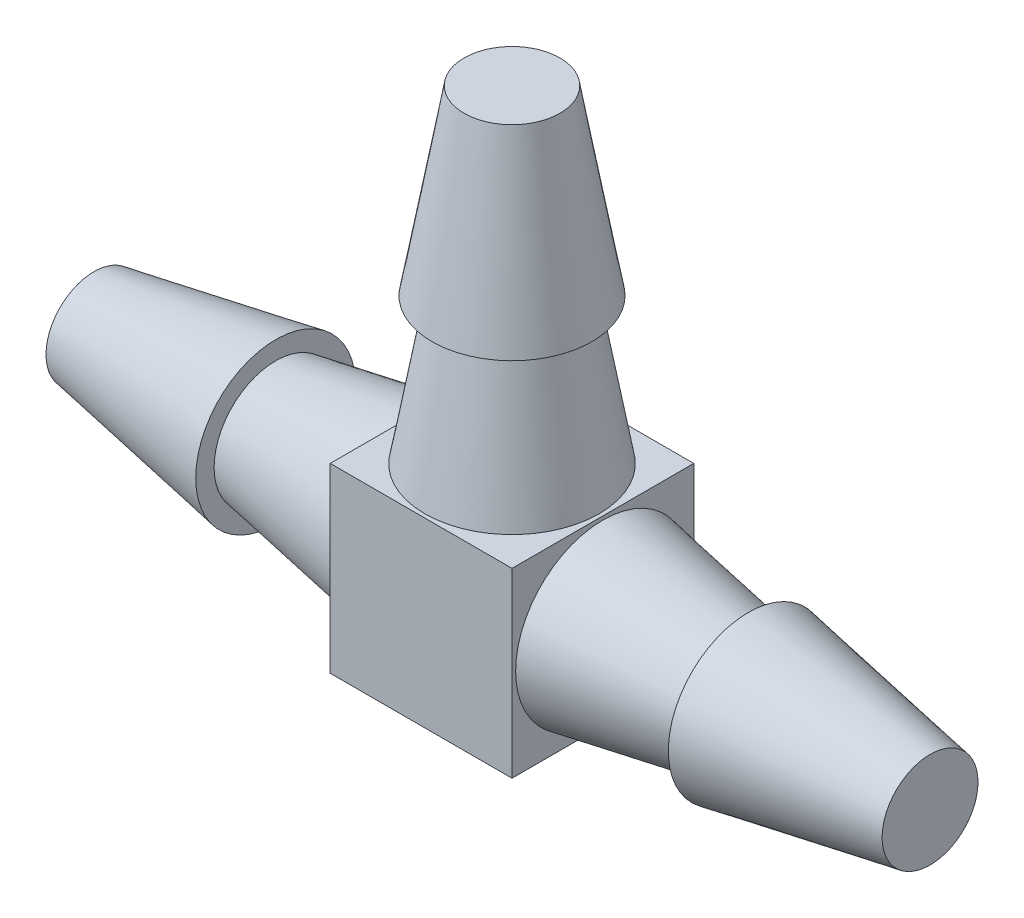
ISO-10303-21;
HEADER;
FILE_DESCRIPTION(('STEP AP214'),'2;1');
FILE_NAME('part.step','',(''),(''),'','','');
FILE_SCHEMA(('AUTOMOTIVE_DESIGN { 1 0 10303 214 1 1 1 1 }'));
ENDSEC;
DATA;
#1=APPLICATION_CONTEXT('core data for automotive mechanical design processes');
#2=APPLICATION_PROTOCOL_DEFINITION('international standard','automotive_design',2000,#1);
#3=PRODUCT_CONTEXT('',#1,'mechanical');
#4=PRODUCT('Part','Part','',(#3));
#5=PRODUCT_RELATED_PRODUCT_CATEGORY('part','',(#4));
#6=PRODUCT_DEFINITION_FORMATION('','',#4);
#7=PRODUCT_DEFINITION_CONTEXT('part definition',#1,'design');
#8=PRODUCT_DEFINITION('design','',#6,#7);
#9=PRODUCT_DEFINITION_SHAPE('','',#8);
#10=(LENGTH_UNIT() NAMED_UNIT(*) SI_UNIT(.MILLI.,.METRE.));
#11=(NAMED_UNIT(*) PLANE_ANGLE_UNIT() SI_UNIT($,.RADIAN.));
#12=(NAMED_UNIT(*) SI_UNIT($,.STERADIAN.) SOLID_ANGLE_UNIT());
#13=UNCERTAINTY_MEASURE_WITH_UNIT(LENGTH_MEASURE(1.E-05),#10,'distance_accuracy_value','');
#14=(GEOMETRIC_REPRESENTATION_CONTEXT(3) GLOBAL_UNCERTAINTY_ASSIGNED_CONTEXT((#13)) GLOBAL_UNIT_ASSIGNED_CONTEXT((#10,
#11,#12)) REPRESENTATION_CONTEXT('',''));
#15=CARTESIAN_POINT('',(0.,0.,0.));
#16=DIRECTION('',(0.,0.,1.));
#17=DIRECTION('',(1.,0.,0.));
#18=AXIS2_PLACEMENT_3D('',#15,#16,#17);
#19=CARTESIAN_POINT('',(-19.3294385432473,-8.2685128983308,5.));
#20=DIRECTION('',(1.,0.,0.));
#21=DIRECTION('',(0.,0.,-1.));
#22=AXIS2_PLACEMENT_3D('',#19,#20,#21);
#23=PLANE('',#22);
#24=DIRECTION('',(0.,-1.,0.));
#25=VECTOR('',#24,1.);
#26=CARTESIAN_POINT('',(-19.3294385432473,-8.2685128983308,0.));
#27=LINE('',#26,#25);
#28=CARTESIAN_POINT('',(-19.3294385432473,-8.2685128983308,0.));
#29=VERTEX_POINT('',#28);
#30=CARTESIAN_POINT('',(-19.3294385432473,-13.2685128983308,0.));
#31=VERTEX_POINT('',#30);
#32=EDGE_CURVE('E75',#29,#31,#27,.T.);
#33=ORIENTED_EDGE('',*,*,#32,.T.);
#34=DIRECTION('',(0.,0.,-1.));
#35=VECTOR('',#34,1.);
#36=CARTESIAN_POINT('',(-19.3294385432473,-13.2685128983308,5.));
#37=LINE('',#36,#35);
#38=CARTESIAN_POINT('',(-19.3294385432473,-13.2685128983308,5.));
#39=VERTEX_POINT('',#38);
#40=EDGE_CURVE('E93',#39,#31,#37,.T.);
#41=ORIENTED_EDGE('',*,*,#40,.F.);
#42=DIRECTION('',(0.,-1.,0.));
#43=VECTOR('',#42,1.);
#44=CARTESIAN_POINT('',(-19.3294385432473,-8.2685128983308,5.));
#45=LINE('',#44,#43);
#46=CARTESIAN_POINT('',(-19.3294385432473,-8.2685128983308,5.));
#47=VERTEX_POINT('',#46);
#48=EDGE_CURVE('E89',#47,#39,#45,.T.);
#49=ORIENTED_EDGE('',*,*,#48,.F.);
#50=DIRECTION('',(0.,0.,-1.));
#51=VECTOR('',#50,1.);
#52=CARTESIAN_POINT('',(-19.3294385432473,-8.2685128983308,5.));
#53=LINE('',#52,#51);
#54=EDGE_CURVE('E87',#47,#29,#53,.T.);
#55=ORIENTED_EDGE('',*,*,#54,.T.);
#56=EDGE_LOOP('',(#33,#41,#49,#55));
#57=FACE_BOUND('',#56,.T.);
#58=CARTESIAN_POINT('',(-19.3294385432473,-10.7685128983308,2.5));
#59=DIRECTION('',(1.,0.,0.));
#60=DIRECTION('',(0.,0.,-1.));
#61=AXIS2_PLACEMENT_3D('',#58,#59,#60);
#62=CIRCLE('',#61,2.4);
#63=CARTESIAN_POINT('',(-19.3294385432473,-10.7685128983308,0.100000000000001));
#64=VERTEX_POINT('',#63);
#65=EDGE_CURVE('E11',#64,#64,#62,.F.);
#66=ORIENTED_EDGE('',*,*,#65,.F.);
#67=EDGE_LOOP('',(#66));
#68=FACE_BOUND('',#67,.T.);
#69=ADVANCED_FACE('F34',(#57,#68),#23,.F.);
#70=CARTESIAN_POINT('',(-19.3294385432473,-8.2685128983308,5.));
#71=DIRECTION('',(0.,-1.,0.));
#72=DIRECTION('',(1.,0.,0.));
#73=AXIS2_PLACEMENT_3D('',#70,#71,#72);
#74=PLANE('',#73);
#75=DIRECTION('',(-1.,0.,0.));
#76=VECTOR('',#75,1.);
#77=CARTESIAN_POINT('',(-19.3294385432473,-8.2685128983308,0.));
#78=LINE('',#77,#76);
#79=CARTESIAN_POINT('',(-14.3294385432473,-8.2685128983308,0.));
#80=VERTEX_POINT('',#79);
#81=EDGE_CURVE('E80',#80,#29,#78,.T.);
#82=ORIENTED_EDGE('',*,*,#81,.T.);
#83=ORIENTED_EDGE('',*,*,#54,.F.);
#84=DIRECTION('',(-1.,0.,0.));
#85=VECTOR('',#84,1.);
#86=CARTESIAN_POINT('',(-19.3294385432473,-8.2685128983308,5.));
#87=LINE('',#86,#85);
#88=CARTESIAN_POINT('',(-14.3294385432473,-8.2685128983308,5.));
#89=VERTEX_POINT('',#88);
#90=EDGE_CURVE('E108',#89,#47,#87,.T.);
#91=ORIENTED_EDGE('',*,*,#90,.F.);
#92=DIRECTION('',(0.,0.,-1.));
#93=VECTOR('',#92,1.);
#94=CARTESIAN_POINT('',(-14.3294385432473,-8.2685128983308,5.));
#95=LINE('',#94,#93);
#96=EDGE_CURVE('E97',#89,#80,#95,.T.);
#97=ORIENTED_EDGE('',*,*,#96,.T.);
#98=EDGE_LOOP('',(#82,#83,#91,#97));
#99=FACE_BOUND('',#98,.T.);
#100=CARTESIAN_POINT('',(-16.8294385432473,-8.2685128983308,2.5));
#101=DIRECTION('',(0.,-1.,0.));
#102=DIRECTION('',(1.,0.,0.));
#103=AXIS2_PLACEMENT_3D('',#100,#101,#102);
#104=CIRCLE('',#103,2.4);
#105=CARTESIAN_POINT('',(-14.4294385432473,-8.2685128983308,2.5));
#106=VERTEX_POINT('',#105);
#107=EDGE_CURVE('E42',#106,#106,#104,.F.);
#108=ORIENTED_EDGE('',*,*,#107,.F.);
#109=EDGE_LOOP('',(#108));
#110=FACE_BOUND('',#109,.T.);
#111=ADVANCED_FACE('F36',(#99,#110),#74,.F.);
#112=CARTESIAN_POINT('',(-14.3294385432473,-8.2685128983308,5.));
#113=DIRECTION('',(-1.,0.,0.));
#114=DIRECTION('',(0.,0.,1.));
#115=AXIS2_PLACEMENT_3D('',#112,#113,#114);
#116=PLANE('',#115);
#117=DIRECTION('',(0.,1.,0.));
#118=VECTOR('',#117,1.);
#119=CARTESIAN_POINT('',(-14.3294385432473,-8.2685128983308,0.));
#120=LINE('',#119,#118);
#121=CARTESIAN_POINT('',(-14.3294385432473,-13.2685128983308,0.));
#122=VERTEX_POINT('',#121);
#123=EDGE_CURVE('E106',#122,#80,#120,.T.);
#124=ORIENTED_EDGE('',*,*,#123,.T.);
#125=ORIENTED_EDGE('',*,*,#96,.F.);
#126=DIRECTION('',(0.,1.,0.));
#127=VECTOR('',#126,1.);
#128=CARTESIAN_POINT('',(-14.3294385432473,-8.2685128983308,5.));
#129=LINE('',#128,#127);
#130=CARTESIAN_POINT('',(-14.3294385432473,-13.2685128983308,5.));
#131=VERTEX_POINT('',#130);
#132=EDGE_CURVE('E49',#131,#89,#129,.T.);
#133=ORIENTED_EDGE('',*,*,#132,.F.);
#134=DIRECTION('',(0.,0.,-1.));
#135=VECTOR('',#134,1.);
#136=CARTESIAN_POINT('',(-14.3294385432473,-13.2685128983308,5.));
#137=LINE('',#136,#135);
#138=EDGE_CURVE('E114',#131,#122,#137,.T.);
#139=ORIENTED_EDGE('',*,*,#138,.T.);
#140=EDGE_LOOP('',(#124,#125,#133,#139));
#141=FACE_BOUND('',#140,.T.);
#142=CARTESIAN_POINT('',(-14.3294385432473,-10.7685128983308,2.5));
#143=DIRECTION('',(-1.,0.,0.));
#144=DIRECTION('',(0.,0.,1.));
#145=AXIS2_PLACEMENT_3D('',#142,#143,#144);
#146=CIRCLE('',#145,2.4);
#147=CARTESIAN_POINT('',(-14.3294385432473,-10.7685128983308,4.9));
#148=VERTEX_POINT('',#147);
#149=EDGE_CURVE('E92',#148,#148,#146,.F.);
#150=ORIENTED_EDGE('',*,*,#149,.F.);
#151=EDGE_LOOP('',(#150));
#152=FACE_BOUND('',#151,.T.);
#153=ADVANCED_FACE('F124',(#141,#152),#116,.F.);
#154=CARTESIAN_POINT('',(-19.3294385432473,-13.2685128983308,5.));
#155=DIRECTION('',(0.,1.,0.));
#156=DIRECTION('',(-1.,0.,0.));
#157=AXIS2_PLACEMENT_3D('',#154,#155,#156);
#158=PLANE('',#157);
#159=DIRECTION('',(1.,0.,0.));
#160=VECTOR('',#159,1.);
#161=CARTESIAN_POINT('',(-19.3294385432473,-13.2685128983308,0.));
#162=LINE('',#161,#160);
#163=EDGE_CURVE('E81',#31,#122,#162,.T.);
#164=ORIENTED_EDGE('',*,*,#163,.T.);
#165=ORIENTED_EDGE('',*,*,#138,.F.);
#166=DIRECTION('',(1.,0.,0.));
#167=VECTOR('',#166,1.);
#168=CARTESIAN_POINT('',(-19.3294385432473,-13.2685128983308,5.));
#169=LINE('',#168,#167);
#170=EDGE_CURVE('E54',#39,#131,#169,.T.);
#171=ORIENTED_EDGE('',*,*,#170,.F.);
#172=ORIENTED_EDGE('',*,*,#40,.T.);
#173=EDGE_LOOP('',(#164,#165,#171,#172));
#174=FACE_BOUND('',#173,.T.);
#175=ADVANCED_FACE('F129',(#174),#158,.F.);
#176=CARTESIAN_POINT('',(-14.3294385432473,-8.2685128983308,5.));
#177=DIRECTION('',(0.,0.,-1.));
#178=DIRECTION('',(-1.,0.,0.));
#179=AXIS2_PLACEMENT_3D('',#176,#177,#178);
#180=PLANE('',#179);
#181=ORIENTED_EDGE('',*,*,#90,.T.);
#182=ORIENTED_EDGE('',*,*,#48,.T.);
#183=ORIENTED_EDGE('',*,*,#170,.T.);
#184=ORIENTED_EDGE('',*,*,#132,.T.);
#185=EDGE_LOOP('',(#181,#182,#183,#184));
#186=FACE_BOUND('',#185,.T.);
#187=ADVANCED_FACE('F136',(#186),#180,.F.);
#188=CARTESIAN_POINT('',(-14.3294385432473,-8.2685128983308,0.));
#189=DIRECTION('',(0.,0.,-1.));
#190=DIRECTION('',(-1.,0.,0.));
#191=AXIS2_PLACEMENT_3D('',#188,#189,#190);
#192=PLANE('',#191);
#193=ORIENTED_EDGE('',*,*,#81,.F.);
#194=ORIENTED_EDGE('',*,*,#123,.F.);
#195=ORIENTED_EDGE('',*,*,#163,.F.);
#196=ORIENTED_EDGE('',*,*,#32,.F.);
#197=EDGE_LOOP('',(#193,#194,#195,#196));
#198=FACE_BOUND('',#197,.T.);
#199=ADVANCED_FACE('F77',(#198),#192,.T.);
#200=CARTESIAN_POINT('',(-14.3294385432473,-10.7685128983308,2.5));
#201=DIRECTION('',(-1.,0.,0.));
#202=DIRECTION('',(0.,0.,-1.));
#203=AXIS2_PLACEMENT_3D('',#200,#201,#202);
#204=CONICAL_SURFACE('',#203,2.4,0.174532925199433);
#205=CARTESIAN_POINT('',(-10.3294385432473,-10.7685128983308,2.5));
#206=DIRECTION('',(1.,0.,0.));
#207=DIRECTION('',(0.,0.,-1.));
#208=AXIS2_PLACEMENT_3D('',#205,#206,#207);
#209=CIRCLE('',#208,1.69469207716614);
#210=CARTESIAN_POINT('',(-10.3294385432473,-10.7685128983308,0.805307922833862));
#211=VERTEX_POINT('',#210);
#212=EDGE_CURVE('E98',#211,#211,#209,.T.);
#213=ORIENTED_EDGE('',*,*,#212,.F.);
#214=EDGE_LOOP('',(#213));
#215=FACE_BOUND('',#214,.T.);
#216=ORIENTED_EDGE('',*,*,#149,.T.);
#217=EDGE_LOOP('',(#216));
#218=FACE_BOUND('',#217,.T.);
#219=ADVANCED_FACE('F143',(#215,#218),#204,.T.);
#220=CARTESIAN_POINT('',(-16.8294385432473,-8.2685128983308,2.5));
#221=DIRECTION('',(0.,-1.,0.));
#222=DIRECTION('',(-1.,0.,0.));
#223=AXIS2_PLACEMENT_3D('',#220,#221,#222);
#224=CONICAL_SURFACE('',#223,2.4,0.174532925199433);
#225=CARTESIAN_POINT('',(-16.8294385432473,-4.2685128983308,2.5));
#226=DIRECTION('',(0.,1.,0.));
#227=DIRECTION('',(-1.,0.,0.));
#228=AXIS2_PLACEMENT_3D('',#225,#226,#227);
#229=CIRCLE('',#228,1.69469207716614);
#230=CARTESIAN_POINT('',(-18.5241306204135,-4.2685128983308,2.5));
#231=VERTEX_POINT('',#230);
#232=EDGE_CURVE('E101',#231,#231,#229,.T.);
#233=ORIENTED_EDGE('',*,*,#232,.F.);
#234=EDGE_LOOP('',(#233));
#235=FACE_BOUND('',#234,.T.);
#236=ORIENTED_EDGE('',*,*,#107,.T.);
#237=EDGE_LOOP('',(#236));
#238=FACE_BOUND('',#237,.T.);
#239=ADVANCED_FACE('F122',(#235,#238),#224,.T.);
#240=CARTESIAN_POINT('',(-19.3294385432473,-10.7685128983308,2.5));
#241=DIRECTION('',(1.,0.,0.));
#242=DIRECTION('',(0.,0.,1.));
#243=AXIS2_PLACEMENT_3D('',#240,#241,#242);
#244=CONICAL_SURFACE('',#243,2.4,0.174532925199433);
#245=CARTESIAN_POINT('',(-23.3294385432473,-10.7685128983308,2.5));
#246=DIRECTION('',(-1.,0.,0.));
#247=DIRECTION('',(0.,0.,1.));
#248=AXIS2_PLACEMENT_3D('',#245,#246,#247);
#249=CIRCLE('',#248,1.69469207716614);
#250=CARTESIAN_POINT('',(-23.3294385432473,-10.7685128983308,4.19469207716614));
#251=VERTEX_POINT('',#250);
#252=EDGE_CURVE('E217',#251,#251,#249,.T.);
#253=ORIENTED_EDGE('',*,*,#252,.F.);
#254=EDGE_LOOP('',(#253));
#255=FACE_BOUND('',#254,.T.);
#256=ORIENTED_EDGE('',*,*,#65,.T.);
#257=EDGE_LOOP('',(#256));
#258=FACE_BOUND('',#257,.T.);
#259=ADVANCED_FACE('F149',(#255,#258),#244,.T.);
#260=CARTESIAN_POINT('',(-23.3294385432473,-10.7685128983308,2.5));
#261=DIRECTION('',(-1.,0.,0.));
#262=DIRECTION('',(0.,0.,1.));
#263=AXIS2_PLACEMENT_3D('',#260,#261,#262);
#264=PLANE('',#263);
#265=CARTESIAN_POINT('',(-23.3294385432473,-10.7685128983308,2.5));
#266=DIRECTION('',(-1.,0.,0.));
#267=DIRECTION('',(0.,0.,1.));
#268=AXIS2_PLACEMENT_3D('',#265,#266,#267);
#269=CIRCLE('',#268,2.2);
#270=CARTESIAN_POINT('',(-23.3294385432473,-10.7685128983308,4.7));
#271=VERTEX_POINT('',#270);
#272=EDGE_CURVE('E211',#271,#271,#269,.T.);
#273=ORIENTED_EDGE('',*,*,#272,.F.);
#274=EDGE_LOOP('',(#273));
#275=FACE_BOUND('',#274,.T.);
#276=ORIENTED_EDGE('',*,*,#252,.T.);
#277=EDGE_LOOP('',(#276));
#278=FACE_BOUND('',#277,.T.);
#279=ADVANCED_FACE('F153',(#275,#278),#264,.F.);
#280=CARTESIAN_POINT('',(-23.3294385432473,-10.7685128983308,2.5));
#281=DIRECTION('',(1.,0.,0.));
#282=DIRECTION('',(0.,0.,1.));
#283=AXIS2_PLACEMENT_3D('',#280,#281,#282);
#284=CONICAL_SURFACE('',#283,2.2,0.174532925199433);
#285=CARTESIAN_POINT('',(-28.3294385432473,-10.7685128983308,2.5));
#286=DIRECTION('',(-1.,0.,0.));
#287=DIRECTION('',(0.,0.,1.));
#288=AXIS2_PLACEMENT_3D('',#285,#286,#287);
#289=CIRCLE('',#288,1.31836509645767);
#290=CARTESIAN_POINT('',(-28.3294385432473,-10.7685128983308,3.81836509645767));
#291=VERTEX_POINT('',#290);
#292=EDGE_CURVE('E214',#291,#291,#289,.T.);
#293=ORIENTED_EDGE('',*,*,#292,.F.);
#294=EDGE_LOOP('',(#293));
#295=FACE_BOUND('',#294,.T.);
#296=ORIENTED_EDGE('',*,*,#272,.T.);
#297=EDGE_LOOP('',(#296));
#298=FACE_BOUND('',#297,.T.);
#299=ADVANCED_FACE('F155',(#295,#298),#284,.T.);
#300=CARTESIAN_POINT('',(-28.3294385432473,-10.7685128983308,2.5));
#301=DIRECTION('',(-1.,0.,0.));
#302=DIRECTION('',(0.,0.,1.));
#303=AXIS2_PLACEMENT_3D('',#300,#301,#302);
#304=PLANE('',#303);
#305=ORIENTED_EDGE('',*,*,#292,.T.);
#306=EDGE_LOOP('',(#305));
#307=FACE_BOUND('',#306,.T.);
#308=ADVANCED_FACE('F158',(#307),#304,.T.);
#309=CARTESIAN_POINT('',(-16.8294385432473,-4.2685128983308,2.5));
#310=DIRECTION('',(0.,1.,0.));
#311=DIRECTION('',(-1.,0.,0.));
#312=AXIS2_PLACEMENT_3D('',#309,#310,#311);
#313=PLANE('',#312);
#314=CARTESIAN_POINT('',(-16.8294385432473,-4.2685128983308,2.5));
#315=DIRECTION('',(0.,1.,0.));
#316=DIRECTION('',(-1.,0.,0.));
#317=AXIS2_PLACEMENT_3D('',#314,#315,#316);
#318=CIRCLE('',#317,2.2);
#319=CARTESIAN_POINT('',(-19.0294385432473,-4.2685128983308,2.5));
#320=VERTEX_POINT('',#319);
#321=EDGE_CURVE('E203',#320,#320,#318,.T.);
#322=ORIENTED_EDGE('',*,*,#321,.F.);
#323=EDGE_LOOP('',(#322));
#324=FACE_BOUND('',#323,.T.);
#325=ORIENTED_EDGE('',*,*,#232,.T.);
#326=EDGE_LOOP('',(#325));
#327=FACE_BOUND('',#326,.T.);
#328=ADVANCED_FACE('F162',(#324,#327),#313,.F.);
#329=CARTESIAN_POINT('',(-16.8294385432473,-4.2685128983308,2.5));
#330=DIRECTION('',(0.,-1.,0.));
#331=DIRECTION('',(-1.,0.,0.));
#332=AXIS2_PLACEMENT_3D('',#329,#330,#331);
#333=CONICAL_SURFACE('',#332,2.2,0.174532925199433);
#334=CARTESIAN_POINT('',(-16.8294385432473,0.731487101669199,2.5));
#335=DIRECTION('',(0.,1.,0.));
#336=DIRECTION('',(-1.,0.,0.));
#337=AXIS2_PLACEMENT_3D('',#334,#335,#336);
#338=CIRCLE('',#337,1.31836509645768);
#339=CARTESIAN_POINT('',(-18.147803639705,0.731487101669199,2.5));
#340=VERTEX_POINT('',#339);
#341=EDGE_CURVE('E208',#340,#340,#338,.T.);
#342=ORIENTED_EDGE('',*,*,#341,.F.);
#343=EDGE_LOOP('',(#342));
#344=FACE_BOUND('',#343,.T.);
#345=ORIENTED_EDGE('',*,*,#321,.T.);
#346=EDGE_LOOP('',(#345));
#347=FACE_BOUND('',#346,.T.);
#348=ADVANCED_FACE('F167',(#344,#347),#333,.T.);
#349=CARTESIAN_POINT('',(-16.8294385432473,0.731487101669199,2.5));
#350=DIRECTION('',(0.,1.,0.));
#351=DIRECTION('',(-1.,0.,0.));
#352=AXIS2_PLACEMENT_3D('',#349,#350,#351);
#353=PLANE('',#352);
#354=ORIENTED_EDGE('',*,*,#341,.T.);
#355=EDGE_LOOP('',(#354));
#356=FACE_BOUND('',#355,.T.);
#357=ADVANCED_FACE('F170',(#356),#353,.T.);
#358=CARTESIAN_POINT('',(-10.3294385432473,-10.7685128983308,2.5));
#359=DIRECTION('',(1.,0.,0.));
#360=DIRECTION('',(0.,0.,-1.));
#361=AXIS2_PLACEMENT_3D('',#358,#359,#360);
#362=PLANE('',#361);
#363=CARTESIAN_POINT('',(-10.3294385432473,-10.7685128983308,2.5));
#364=DIRECTION('',(1.,0.,0.));
#365=DIRECTION('',(0.,0.,-1.));
#366=AXIS2_PLACEMENT_3D('',#363,#364,#365);
#367=CIRCLE('',#366,2.2);
#368=CARTESIAN_POINT('',(-10.3294385432473,-10.7685128983308,0.3));
#369=VERTEX_POINT('',#368);
#370=EDGE_CURVE('E194',#369,#369,#367,.T.);
#371=ORIENTED_EDGE('',*,*,#370,.F.);
#372=EDGE_LOOP('',(#371));
#373=FACE_BOUND('',#372,.T.);
#374=ORIENTED_EDGE('',*,*,#212,.T.);
#375=EDGE_LOOP('',(#374));
#376=FACE_BOUND('',#375,.T.);
#377=ADVANCED_FACE('F174',(#373,#376),#362,.F.);
#378=CARTESIAN_POINT('',(-10.3294385432473,-10.7685128983308,2.5));
#379=DIRECTION('',(-1.,0.,0.));
#380=DIRECTION('',(0.,0.,-1.));
#381=AXIS2_PLACEMENT_3D('',#378,#379,#380);
#382=CONICAL_SURFACE('',#381,2.2,0.174532925199433);
#383=CARTESIAN_POINT('',(-5.32943854324733,-10.7685128983308,2.5));
#384=DIRECTION('',(1.,0.,0.));
#385=DIRECTION('',(0.,0.,-1.));
#386=AXIS2_PLACEMENT_3D('',#383,#384,#385);
#387=CIRCLE('',#386,1.31836509645767);
#388=CARTESIAN_POINT('',(-5.32943854324733,-10.7685128983308,1.18163490354233));
#389=VERTEX_POINT('',#388);
#390=EDGE_CURVE('E200',#389,#389,#387,.T.);
#391=ORIENTED_EDGE('',*,*,#390,.F.);
#392=EDGE_LOOP('',(#391));
#393=FACE_BOUND('',#392,.T.);
#394=ORIENTED_EDGE('',*,*,#370,.T.);
#395=EDGE_LOOP('',(#394));
#396=FACE_BOUND('',#395,.T.);
#397=ADVANCED_FACE('F179',(#393,#396),#382,.T.);
#398=CARTESIAN_POINT('',(-5.32943854324733,-10.7685128983308,2.5));
#399=DIRECTION('',(1.,0.,0.));
#400=DIRECTION('',(0.,0.,-1.));
#401=AXIS2_PLACEMENT_3D('',#398,#399,#400);
#402=PLANE('',#401);
#403=ORIENTED_EDGE('',*,*,#390,.T.);
#404=EDGE_LOOP('',(#403));
#405=FACE_BOUND('',#404,.T.);
#406=ADVANCED_FACE('F182',(#405),#402,.T.);
#407=CLOSED_SHELL('',(#69,#111,#153,#175,#187,#199,#219,#239,#259,#279,#299,#308,#328,#348,#357,
#377,#397,#406));
#408=MANIFOLD_SOLID_BREP('B2',#407);
#409=ADVANCED_BREP_SHAPE_REPRESENTATION('',(#18,#408),#14);
#410=SHAPE_DEFINITION_REPRESENTATION(#9,#409);
ENDSEC;
END-ISO-10303-21;
